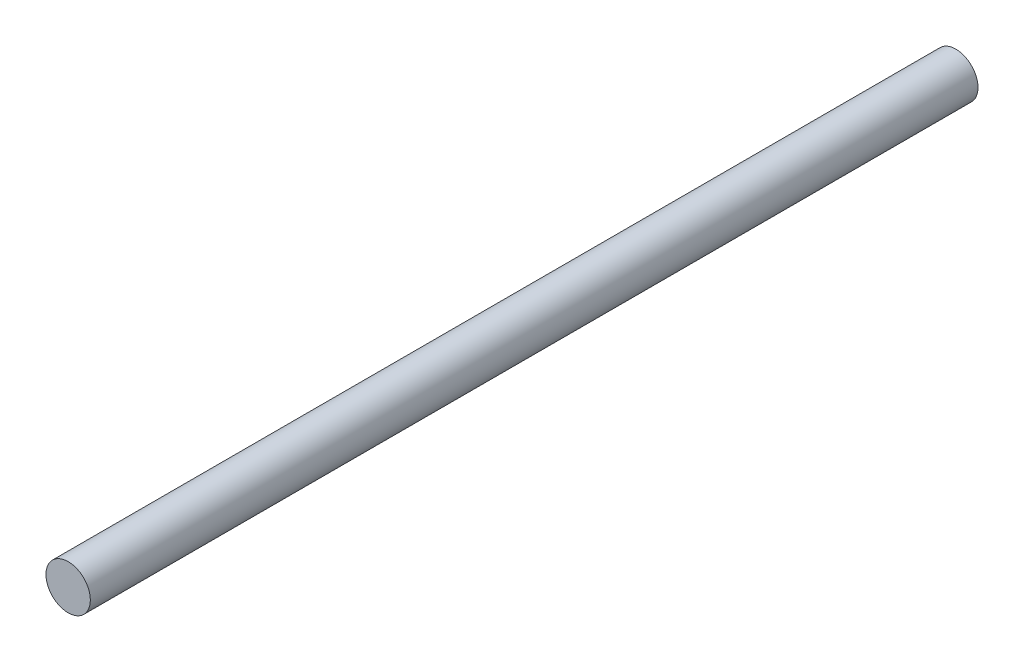
ISO-10303-21;
HEADER;
FILE_DESCRIPTION(('STEP AP214'),'2;1');
FILE_NAME('part.step','',(''),(''),'','','');
FILE_SCHEMA(('AUTOMOTIVE_DESIGN { 1 0 10303 214 1 1 1 1 }'));
ENDSEC;
DATA;
#1=APPLICATION_CONTEXT('core data for automotive mechanical design processes');
#2=APPLICATION_PROTOCOL_DEFINITION('international standard','automotive_design',2000,#1);
#3=PRODUCT_CONTEXT('',#1,'mechanical');
#4=PRODUCT('Part','Part','',(#3));
#5=PRODUCT_RELATED_PRODUCT_CATEGORY('part','',(#4));
#6=PRODUCT_DEFINITION_FORMATION('','',#4);
#7=PRODUCT_DEFINITION_CONTEXT('part definition',#1,'design');
#8=PRODUCT_DEFINITION('design','',#6,#7);
#9=PRODUCT_DEFINITION_SHAPE('','',#8);
#10=(LENGTH_UNIT() NAMED_UNIT(*) SI_UNIT(.MILLI.,.METRE.));
#11=(NAMED_UNIT(*) PLANE_ANGLE_UNIT() SI_UNIT($,.RADIAN.));
#12=(NAMED_UNIT(*) SI_UNIT($,.STERADIAN.) SOLID_ANGLE_UNIT());
#13=UNCERTAINTY_MEASURE_WITH_UNIT(LENGTH_MEASURE(1.E-05),#10,'distance_accuracy_value','');
#14=(GEOMETRIC_REPRESENTATION_CONTEXT(3) GLOBAL_UNCERTAINTY_ASSIGNED_CONTEXT((#13)) GLOBAL_UNIT_ASSIGNED_CONTEXT((#10,
#11,#12)) REPRESENTATION_CONTEXT('',''));
#15=CARTESIAN_POINT('',(0.,0.,0.));
#16=DIRECTION('',(0.,0.,1.));
#17=DIRECTION('',(1.,0.,0.));
#18=AXIS2_PLACEMENT_3D('',#15,#16,#17);
#19=CARTESIAN_POINT('',(0.,0.,400.));
#20=DIRECTION('',(0.,0.,-1.));
#21=DIRECTION('',(-1.,0.,0.));
#22=AXIS2_PLACEMENT_3D('',#19,#20,#21);
#23=CYLINDRICAL_SURFACE('',#22,10.);
#24=CARTESIAN_POINT('',(0.,0.,400.));
#25=DIRECTION('',(0.,0.,1.));
#26=DIRECTION('',(1.,0.,0.));
#27=AXIS2_PLACEMENT_3D('',#24,#25,#26);
#28=CIRCLE('',#27,10.);
#29=CARTESIAN_POINT('',(10.,0.,400.));
#30=VERTEX_POINT('',#29);
#31=EDGE_CURVE('E10',#30,#30,#28,.T.);
#32=ORIENTED_EDGE('',*,*,#31,.F.);
#33=EDGE_LOOP('',(#32));
#34=FACE_BOUND('',#33,.T.);
#35=CARTESIAN_POINT('',(0.,0.,0.));
#36=DIRECTION('',(0.,0.,1.));
#37=DIRECTION('',(1.,0.,0.));
#38=AXIS2_PLACEMENT_3D('',#35,#36,#37);
#39=CIRCLE('',#38,10.);
#40=CARTESIAN_POINT('',(10.,0.,0.));
#41=VERTEX_POINT('',#40);
#42=EDGE_CURVE('E40',#41,#41,#39,.T.);
#43=ORIENTED_EDGE('',*,*,#42,.T.);
#44=EDGE_LOOP('',(#43));
#45=FACE_BOUND('',#44,.T.);
#46=ADVANCED_FACE('F37',(#34,#45),#23,.T.);
#47=CARTESIAN_POINT('',(0.,0.,400.));
#48=DIRECTION('',(0.,0.,1.));
#49=DIRECTION('',(1.,0.,0.));
#50=AXIS2_PLACEMENT_3D('',#47,#48,#49);
#51=PLANE('',#50);
#52=ORIENTED_EDGE('',*,*,#31,.T.);
#53=EDGE_LOOP('',(#52));
#54=FACE_BOUND('',#53,.T.);
#55=ADVANCED_FACE('F54',(#54),#51,.T.);
#56=CARTESIAN_POINT('',(0.,0.,0.));
#57=DIRECTION('',(0.,0.,1.));
#58=DIRECTION('',(1.,0.,0.));
#59=AXIS2_PLACEMENT_3D('',#56,#57,#58);
#60=PLANE('',#59);
#61=ORIENTED_EDGE('',*,*,#42,.F.);
#62=EDGE_LOOP('',(#61));
#63=FACE_BOUND('',#62,.T.);
#64=ADVANCED_FACE('F52',(#63),#60,.F.);
#65=CLOSED_SHELL('',(#46,#55,#64));
#66=MANIFOLD_SOLID_BREP('B2',#65);
#67=ADVANCED_BREP_SHAPE_REPRESENTATION('',(#18,#66),#14);
#68=SHAPE_DEFINITION_REPRESENTATION(#9,#67);
ENDSEC;
END-ISO-10303-21;
